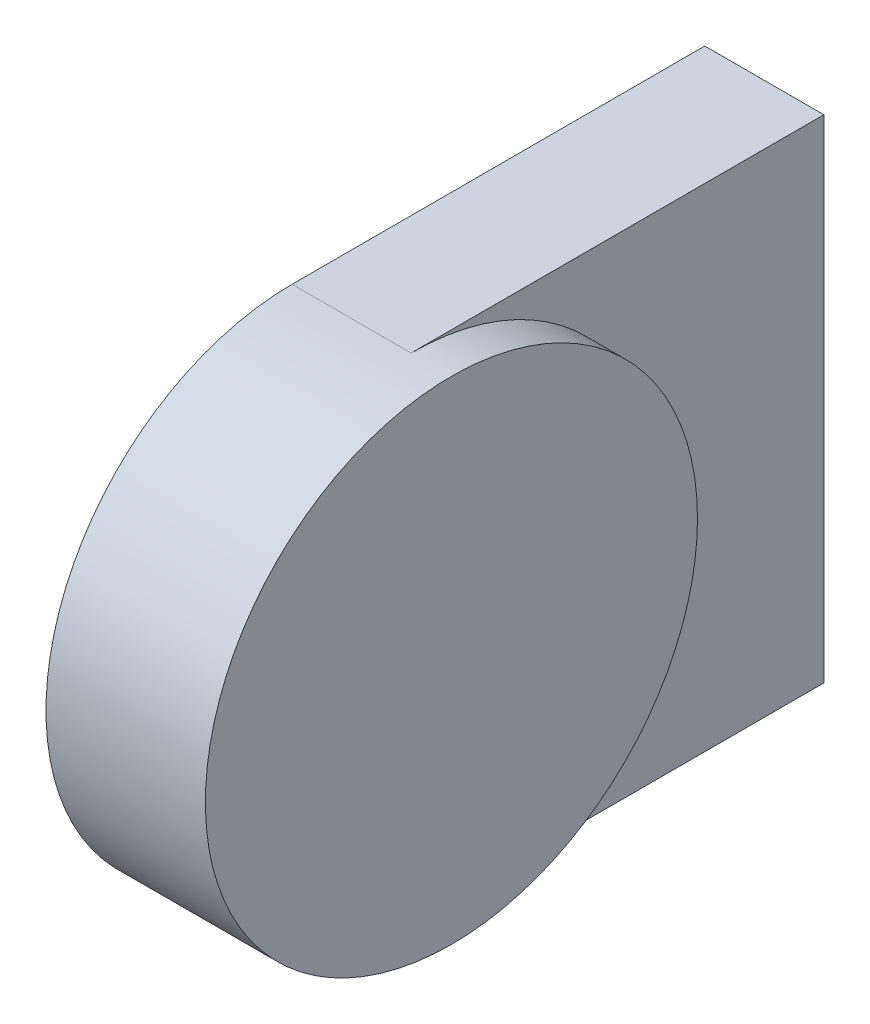
ISO-10303-21;
HEADER;
FILE_DESCRIPTION(('STEP AP214'),'2;1');
FILE_NAME('part.step','',(''),(''),'','','');
FILE_SCHEMA(('AUTOMOTIVE_DESIGN { 1 0 10303 214 1 1 1 1 }'));
ENDSEC;
DATA;
#1=APPLICATION_CONTEXT('core data for automotive mechanical design processes');
#2=APPLICATION_PROTOCOL_DEFINITION('international standard','automotive_design',2000,#1);
#3=PRODUCT_CONTEXT('',#1,'mechanical');
#4=PRODUCT('Part','Part','',(#3));
#5=PRODUCT_RELATED_PRODUCT_CATEGORY('part','',(#4));
#6=PRODUCT_DEFINITION_FORMATION('','',#4);
#7=PRODUCT_DEFINITION_CONTEXT('part definition',#1,'design');
#8=PRODUCT_DEFINITION('design','',#6,#7);
#9=PRODUCT_DEFINITION_SHAPE('','',#8);
#10=(LENGTH_UNIT() NAMED_UNIT(*) SI_UNIT(.MILLI.,.METRE.));
#11=(NAMED_UNIT(*) PLANE_ANGLE_UNIT() SI_UNIT($,.RADIAN.));
#12=(NAMED_UNIT(*) SI_UNIT($,.STERADIAN.) SOLID_ANGLE_UNIT());
#13=UNCERTAINTY_MEASURE_WITH_UNIT(LENGTH_MEASURE(1.E-05),#10,'distance_accuracy_value','');
#14=(GEOMETRIC_REPRESENTATION_CONTEXT(3) GLOBAL_UNCERTAINTY_ASSIGNED_CONTEXT((#13)) GLOBAL_UNIT_ASSIGNED_CONTEXT((#10,
#11,#12)) REPRESENTATION_CONTEXT('',''));
#15=CARTESIAN_POINT('',(0.,0.,0.));
#16=DIRECTION('',(0.,0.,1.));
#17=DIRECTION('',(1.,0.,0.));
#18=AXIS2_PLACEMENT_3D('',#15,#16,#17);
#19=CARTESIAN_POINT('',(75.,155.,0.));
#20=DIRECTION('',(0.,1.,0.));
#21=DIRECTION('',(0.,0.,1.));
#22=AXIS2_PLACEMENT_3D('',#19,#20,#21);
#23=PLANE('',#22);
#24=DIRECTION('',(0.,0.,-1.));
#25=VECTOR('',#24,1.);
#26=CARTESIAN_POINT('',(0.,155.,0.));
#27=LINE('',#26,#25);
#28=CARTESIAN_POINT('',(0.,155.,0.));
#29=VERTEX_POINT('',#28);
#30=CARTESIAN_POINT('',(0.,155.,-260.));
#31=VERTEX_POINT('',#30);
#32=EDGE_CURVE('E95',#29,#31,#27,.T.);
#33=ORIENTED_EDGE('',*,*,#32,.F.);
#34=DIRECTION('',(-1.,0.,0.));
#35=VECTOR('',#34,1.);
#36=CARTESIAN_POINT('',(75.,155.,0.));
#37=LINE('',#36,#35);
#38=CARTESIAN_POINT('',(75.,155.,0.));
#39=VERTEX_POINT('',#38);
#40=EDGE_CURVE('E55',#39,#29,#37,.T.);
#41=ORIENTED_EDGE('',*,*,#40,.F.);
#42=DIRECTION('',(0.,0.,-1.));
#43=VECTOR('',#42,1.);
#44=CARTESIAN_POINT('',(75.,155.,0.));
#45=LINE('',#44,#43);
#46=CARTESIAN_POINT('',(75.,155.,-260.));
#47=VERTEX_POINT('',#46);
#48=EDGE_CURVE('E88',#39,#47,#45,.T.);
#49=ORIENTED_EDGE('',*,*,#48,.T.);
#50=DIRECTION('',(-1.,0.,0.));
#51=VECTOR('',#50,1.);
#52=CARTESIAN_POINT('',(75.,155.,-260.));
#53=LINE('',#52,#51);
#54=EDGE_CURVE('E48',#47,#31,#53,.T.);
#55=ORIENTED_EDGE('',*,*,#54,.T.);
#56=EDGE_LOOP('',(#33,#41,#49,#55));
#57=FACE_BOUND('',#56,.T.);
#58=ADVANCED_FACE('F45',(#57),#23,.T.);
#59=CARTESIAN_POINT('',(75.,0.,0.));
#60=DIRECTION('',(-1.,0.,0.));
#61=DIRECTION('',(0.,0.,1.));
#62=AXIS2_PLACEMENT_3D('',#59,#60,#61);
#63=CYLINDRICAL_SURFACE('',#62,155.);
#64=CARTESIAN_POINT('',(0.,0.,0.));
#65=DIRECTION('',(1.,0.,0.));
#66=DIRECTION('',(0.,0.,-1.));
#67=AXIS2_PLACEMENT_3D('',#64,#65,#66);
#68=CIRCLE('',#67,155.);
#69=CARTESIAN_POINT('',(0.,-155.,0.));
#70=VERTEX_POINT('',#69);
#71=EDGE_CURVE('E79',#29,#70,#68,.T.);
#72=ORIENTED_EDGE('',*,*,#71,.T.);
#73=DIRECTION('',(-1.,0.,0.));
#74=VECTOR('',#73,1.);
#75=CARTESIAN_POINT('',(75.,-155.,0.));
#76=LINE('',#75,#74);
#77=CARTESIAN_POINT('',(75.,-155.,0.));
#78=VERTEX_POINT('',#77);
#79=EDGE_CURVE('E97',#78,#70,#76,.T.);
#80=ORIENTED_EDGE('',*,*,#79,.F.);
#81=CARTESIAN_POINT('',(75.,0.,0.));
#82=DIRECTION('',(1.,0.,0.));
#83=DIRECTION('',(0.,0.,-1.));
#84=AXIS2_PLACEMENT_3D('',#81,#82,#83);
#85=CIRCLE('',#84,155.);
#86=EDGE_CURVE('E11',#78,#39,#85,.T.);
#87=ORIENTED_EDGE('',*,*,#86,.T.);
#88=ORIENTED_EDGE('',*,*,#40,.T.);
#89=EDGE_LOOP('',(#72,#80,#87,#88));
#90=FACE_BOUND('',#89,.T.);
#91=CARTESIAN_POINT('',(100.4,0.,0.));
#92=DIRECTION('',(1.,0.,0.));
#93=DIRECTION('',(0.,0.,-1.));
#94=AXIS2_PLACEMENT_3D('',#91,#92,#93);
#95=CIRCLE('',#94,155.);
#96=CARTESIAN_POINT('',(100.4,0.,-155.));
#97=VERTEX_POINT('',#96);
#98=EDGE_CURVE('E120',#97,#97,#95,.T.);
#99=ORIENTED_EDGE('',*,*,#98,.F.);
#100=EDGE_LOOP('',(#99));
#101=FACE_BOUND('',#100,.T.);
#102=ADVANCED_FACE('F99',(#90,#101),#63,.T.);
#103=CARTESIAN_POINT('',(75.,-155.,0.));
#104=DIRECTION('',(0.,1.,0.));
#105=DIRECTION('',(0.,0.,1.));
#106=AXIS2_PLACEMENT_3D('',#103,#104,#105);
#107=PLANE('',#106);
#108=DIRECTION('',(0.,0.,-1.));
#109=VECTOR('',#108,1.);
#110=CARTESIAN_POINT('',(0.,-155.,0.));
#111=LINE('',#110,#109);
#112=CARTESIAN_POINT('',(0.,-155.,-260.));
#113=VERTEX_POINT('',#112);
#114=EDGE_CURVE('E124',#70,#113,#111,.T.);
#115=ORIENTED_EDGE('',*,*,#114,.T.);
#116=DIRECTION('',(-1.,0.,0.));
#117=VECTOR('',#116,1.);
#118=CARTESIAN_POINT('',(75.,-155.,-260.));
#119=LINE('',#118,#117);
#120=CARTESIAN_POINT('',(75.,-155.,-260.));
#121=VERTEX_POINT('',#120);
#122=EDGE_CURVE('E105',#121,#113,#119,.T.);
#123=ORIENTED_EDGE('',*,*,#122,.F.);
#124=DIRECTION('',(0.,0.,-1.));
#125=VECTOR('',#124,1.);
#126=CARTESIAN_POINT('',(75.,-155.,0.));
#127=LINE('',#126,#125);
#128=EDGE_CURVE('E108',#78,#121,#127,.T.);
#129=ORIENTED_EDGE('',*,*,#128,.F.);
#130=ORIENTED_EDGE('',*,*,#79,.T.);
#131=EDGE_LOOP('',(#115,#123,#129,#130));
#132=FACE_BOUND('',#131,.T.);
#133=ADVANCED_FACE('F109',(#132),#107,.F.);
#134=CARTESIAN_POINT('',(75.,-155.,-260.));
#135=DIRECTION('',(0.,0.,1.));
#136=DIRECTION('',(1.,0.,0.));
#137=AXIS2_PLACEMENT_3D('',#134,#135,#136);
#138=PLANE('',#137);
#139=DIRECTION('',(0.,1.,0.));
#140=VECTOR('',#139,1.);
#141=CARTESIAN_POINT('',(0.,-155.,-260.));
#142=LINE('',#141,#140);
#143=EDGE_CURVE('E119',#113,#31,#142,.T.);
#144=ORIENTED_EDGE('',*,*,#143,.T.);
#145=ORIENTED_EDGE('',*,*,#54,.F.);
#146=DIRECTION('',(0.,1.,0.));
#147=VECTOR('',#146,1.);
#148=CARTESIAN_POINT('',(75.,-155.,-260.));
#149=LINE('',#148,#147);
#150=EDGE_CURVE('E84',#121,#47,#149,.T.);
#151=ORIENTED_EDGE('',*,*,#150,.F.);
#152=ORIENTED_EDGE('',*,*,#122,.T.);
#153=EDGE_LOOP('',(#144,#145,#151,#152));
#154=FACE_BOUND('',#153,.T.);
#155=ADVANCED_FACE('F131',(#154),#138,.F.);
#156=CARTESIAN_POINT('',(75.,0.,0.));
#157=DIRECTION('',(1.,0.,0.));
#158=DIRECTION('',(0.,0.,-1.));
#159=AXIS2_PLACEMENT_3D('',#156,#157,#158);
#160=PLANE('',#159);
#161=ORIENTED_EDGE('',*,*,#86,.F.);
#162=ORIENTED_EDGE('',*,*,#128,.T.);
#163=ORIENTED_EDGE('',*,*,#150,.T.);
#164=ORIENTED_EDGE('',*,*,#48,.F.);
#165=EDGE_LOOP('',(#161,#162,#163,#164));
#166=FACE_BOUND('',#165,.T.);
#167=ADVANCED_FACE('F89',(#166),#160,.T.);
#168=CARTESIAN_POINT('',(0.,0.,0.));
#169=DIRECTION('',(1.,0.,0.));
#170=DIRECTION('',(0.,0.,-1.));
#171=AXIS2_PLACEMENT_3D('',#168,#169,#170);
#172=PLANE('',#171);
#173=ORIENTED_EDGE('',*,*,#32,.T.);
#174=ORIENTED_EDGE('',*,*,#143,.F.);
#175=ORIENTED_EDGE('',*,*,#114,.F.);
#176=ORIENTED_EDGE('',*,*,#71,.F.);
#177=EDGE_LOOP('',(#173,#174,#175,#176));
#178=FACE_BOUND('',#177,.T.);
#179=ADVANCED_FACE('F133',(#178),#172,.F.);
#180=CARTESIAN_POINT('',(100.4,0.,0.));
#181=DIRECTION('',(1.,0.,0.));
#182=DIRECTION('',(0.,0.,-1.));
#183=AXIS2_PLACEMENT_3D('',#180,#181,#182);
#184=PLANE('',#183);
#185=ORIENTED_EDGE('',*,*,#98,.T.);
#186=EDGE_LOOP('',(#185));
#187=FACE_BOUND('',#186,.T.);
#188=ADVANCED_FACE('F135',(#187),#184,.T.);
#189=CLOSED_SHELL('',(#58,#102,#133,#155,#167,#179,#188));
#190=MANIFOLD_SOLID_BREP('B2',#189);
#191=ADVANCED_BREP_SHAPE_REPRESENTATION('',(#18,#190),#14);
#192=SHAPE_DEFINITION_REPRESENTATION(#9,#191);
ENDSEC;
END-ISO-10303-21;
